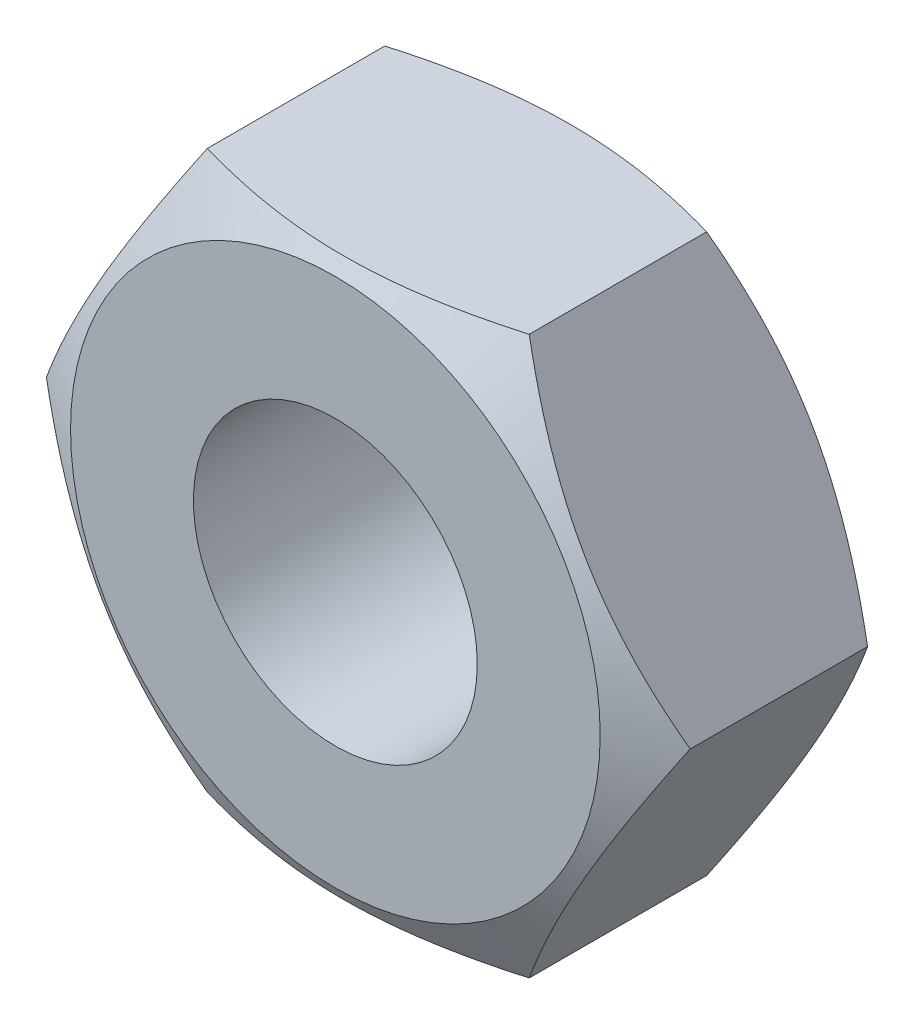
ISO-10303-21;
HEADER;
FILE_DESCRIPTION(('STEP AP214'),'2;1');
FILE_NAME('part.step','',(''),(''),'','','');
FILE_SCHEMA(('AUTOMOTIVE_DESIGN { 1 0 10303 214 1 1 1 1 }'));
ENDSEC;
DATA;
#1=APPLICATION_CONTEXT('core data for automotive mechanical design processes');
#2=APPLICATION_PROTOCOL_DEFINITION('international standard','automotive_design',2000,#1);
#3=PRODUCT_CONTEXT('',#1,'mechanical');
#4=PRODUCT('Part','Part','',(#3));
#5=PRODUCT_RELATED_PRODUCT_CATEGORY('part','',(#4));
#6=PRODUCT_DEFINITION_FORMATION('','',#4);
#7=PRODUCT_DEFINITION_CONTEXT('part definition',#1,'design');
#8=PRODUCT_DEFINITION('design','',#6,#7);
#9=PRODUCT_DEFINITION_SHAPE('','',#8);
#10=(LENGTH_UNIT() NAMED_UNIT(*) SI_UNIT(.MILLI.,.METRE.));
#11=(NAMED_UNIT(*) PLANE_ANGLE_UNIT() SI_UNIT($,.RADIAN.));
#12=(NAMED_UNIT(*) SI_UNIT($,.STERADIAN.) SOLID_ANGLE_UNIT());
#13=UNCERTAINTY_MEASURE_WITH_UNIT(LENGTH_MEASURE(1.E-05),#10,'distance_accuracy_value','');
#14=(GEOMETRIC_REPRESENTATION_CONTEXT(3) GLOBAL_UNCERTAINTY_ASSIGNED_CONTEXT((#13)) GLOBAL_UNIT_ASSIGNED_CONTEXT((#10,
#11,#12)) REPRESENTATION_CONTEXT('',''));
#15=CARTESIAN_POINT('',(0.,0.,0.));
#16=DIRECTION('',(0.,0.,1.));
#17=DIRECTION('',(1.,0.,0.));
#18=AXIS2_PLACEMENT_3D('',#15,#16,#17);
#19=CARTESIAN_POINT('',(0.,0.,0.));
#20=DIRECTION('',(0.,0.,1.));
#21=DIRECTION('',(0.,-1.,0.));
#22=AXIS2_PLACEMENT_3D('',#19,#20,#21);
#23=CONICAL_SURFACE('',#22,2.6125,1.0471975511966);
#24=CARTESIAN_POINT('',(0.,0.,0.));
#25=DIRECTION('',(0.,0.,1.));
#26=DIRECTION('',(1.,0.,0.));
#27=AXIS2_PLACEMENT_3D('',#24,#25,#26);
#28=CIRCLE('',#27,2.6125);
#29=CARTESIAN_POINT('',(2.6125,0.,0.));
#30=VERTEX_POINT('',#29);
#31=EDGE_CURVE('E11',#30,#30,#28,.T.);
#32=ORIENTED_EDGE('',*,*,#31,.T.);
#33=EDGE_LOOP('',(#32));
#34=FACE_BOUND('',#33,.T.);
#35=CARTESIAN_POINT('',(1.58759777021763,2.7502,0.325072425378332));
#36=CARTESIAN_POINT('',(1.65737010029699,2.62935077934009,0.284773324262835));
#37=CARTESIAN_POINT('',(1.72774469983533,2.50745839737737,0.248122564611234));
#38=CARTESIAN_POINT('',(1.86971254687003,2.26156287327211,0.184147844983373));
#39=CARTESIAN_POINT('',(1.94130831721583,2.13755536142614,0.15684651768807));
#40=CARTESIAN_POINT('',(2.08361254889599,1.89107720202406,0.11434740730769));
#41=CARTESIAN_POINT('',(2.15429911309864,1.76864448141258,0.0988667806360306));
#42=CARTESIAN_POINT('',(2.29600490065923,1.52320285763108,0.0803850593835131));
#43=CARTESIAN_POINT('',(2.36702360884404,1.40019484676709,0.0773686614761723));
#44=CARTESIAN_POINT('',(2.49972966594897,1.17034121338921,0.0836388074421193));
#45=CARTESIAN_POINT('',(2.56143686540073,1.06346120874598,0.0913858162902751));
#46=CARTESIAN_POINT('',(2.68444923614047,0.85039753266525,0.115940843077927));
#47=CARTESIAN_POINT('',(2.74575398185008,0.744214598351111,0.132757251664143));
#48=CARTESIAN_POINT('',(2.86902004703206,0.530711510606816,0.174797584359529));
#49=CARTESIAN_POINT('',(2.93096576264318,0.423418383857145,0.200199742700803));
#50=CARTESIAN_POINT('',(3.05393320806134,0.210432520715949,0.257852887853554));
#51=CARTESIAN_POINT('',(3.11495651365995,0.104737054973347,0.290090325312554));
#52=CARTESIAN_POINT('',(3.17554195059678,-0.000199999999999999,0.325072425378332));
#53=B_SPLINE_CURVE_WITH_KNOTS('',3,(#35,#36,#37,#38,#39,#40,#41,#42,#43,#44,#45,#46,#47,#48,#49,
#50,#51,#52),.UNSPECIFIED.,.F.,.F.,(4,2,2,2,2,2,2,2,4),(0.,0.435912828725888,0.872873557116332,
1.29901931904672,1.72464171213574,2.09526089052938,2.46622354066374,2.84541551798557,
3.22386274754524),.UNSPECIFIED.);
#54=CARTESIAN_POINT('',(1.58771324027147,2.75,0.325005755075434));
#55=VERTEX_POINT('',#54);
#56=CARTESIAN_POINT('',(3.17542648054294,0.,0.325005755075434));
#57=VERTEX_POINT('',#56);
#58=EDGE_CURVE('E170',#55,#57,#53,.T.);
#59=ORIENTED_EDGE('',*,*,#58,.T.);
#60=CARTESIAN_POINT('',(3.17554195059678,0.000199999999999895,0.325072425378332));
#61=CARTESIAN_POINT('',(3.10576962051743,-0.120649220659906,0.284773324262835));
#62=CARTESIAN_POINT('',(3.03539502097908,-0.242541602622634,0.248122564611234));
#63=CARTESIAN_POINT('',(2.89342717394439,-0.488437126727893,0.184147844983373));
#64=CARTESIAN_POINT('',(2.82183140359858,-0.612444638573856,0.15684651768807));
#65=CARTESIAN_POINT('',(2.67952717191842,-0.858922797975944,0.114347407307689));
#66=CARTESIAN_POINT('',(2.60884060771577,-0.981355518587418,0.0988667806360305));
#67=CARTESIAN_POINT('',(2.46713482015518,-1.22679714236892,0.0803850593835132));
#68=CARTESIAN_POINT('',(2.39611611197038,-1.34980515323291,0.0773686614761724));
#69=CARTESIAN_POINT('',(2.26341005486544,-1.57965878661079,0.0836388074421194));
#70=CARTESIAN_POINT('',(2.20170285541369,-1.68653879125402,0.0913858162902751));
#71=CARTESIAN_POINT('',(2.07869048467395,-1.89960246733475,0.115940843077928));
#72=CARTESIAN_POINT('',(2.01738573896433,-2.00578540164889,0.132757251664143));
#73=CARTESIAN_POINT('',(1.89411967378235,-2.21928848939318,0.174797584359529));
#74=CARTESIAN_POINT('',(1.83217395817123,-2.32658161614285,0.200199742700803));
#75=CARTESIAN_POINT('',(1.70920651275307,-2.53956747928405,0.257852887853554));
#76=CARTESIAN_POINT('',(1.64818320715446,-2.64526294502665,0.290090325312555));
#77=CARTESIAN_POINT('',(1.58759777021763,-2.7502,0.325072425378332));
#78=B_SPLINE_CURVE_WITH_KNOTS('',3,(#60,#61,#62,#63,#64,#65,#66,#67,#68,#69,#70,#71,#72,#73,#74,
#75,#76,#77),.UNSPECIFIED.,.F.,.F.,(4,2,2,2,2,2,2,2,4),(0.,0.435912828725888,0.872873557116332,
1.29901931904672,1.72464171213574,2.09526089052938,2.46622354066374,2.84541551798557,
3.22386274754524),.UNSPECIFIED.);
#79=CARTESIAN_POINT('',(1.58771324027147,-2.75,0.325005755075434));
#80=VERTEX_POINT('',#79);
#81=EDGE_CURVE('E60',#57,#80,#78,.T.);
#82=ORIENTED_EDGE('',*,*,#81,.T.);
#83=CARTESIAN_POINT('',(4.82209591409801,-2.75,1.69662218758663));
#84=CARTESIAN_POINT('',(4.70698459391359,-2.75,1.63889978333482));
#85=CARTESIAN_POINT('',(4.59167523097896,-2.75,1.58156823824504));
#86=CARTESIAN_POINT('',(4.36057376347925,-2.75,1.46787810056609));
#87=CARTESIAN_POINT('',(4.24478164413152,-2.75,1.4115195380467));
#88=CARTESIAN_POINT('',(4.01240519378639,-2.75,1.29985971222662));
#89=CARTESIAN_POINT('',(3.89581974792902,-2.75,1.24456076421826));
#90=CARTESIAN_POINT('',(3.66197617100479,-2.75,1.13539657081718));
#91=CARTESIAN_POINT('',(3.54471802983216,-2.75,1.08153134703193));
#92=CARTESIAN_POINT('',(3.30402977097251,-2.75,0.973149111400131));
#93=CARTESIAN_POINT('',(3.18056234581917,-2.75,0.918714677644329));
#94=CARTESIAN_POINT('',(2.93258356998985,-2.75,0.8122805667528));
#95=CARTESIAN_POINT('',(2.80807225529914,-2.75,0.760280806091854));
#96=CARTESIAN_POINT('',(2.55789086770319,-2.75,0.659412394645465));
#97=CARTESIAN_POINT('',(2.43222175656898,-2.75,0.61054137344382));
#98=CARTESIAN_POINT('',(2.17937205899324,-2.75,0.516746741866131));
#99=CARTESIAN_POINT('',(2.05219106628962,-2.75,0.471824221027262));
#100=CARTESIAN_POINT('',(1.76687012212302,-2.75,0.377381666854392));
#101=CARTESIAN_POINT('',(1.60829414480963,-2.75,0.329155252936632));
#102=CARTESIAN_POINT('',(1.28838166324069,-2.75,0.243095212306075));
#103=CARTESIAN_POINT('',(1.12704682552895,-2.75,0.205255531555934));
#104=CARTESIAN_POINT('',(0.804469695356104,-2.75,0.143637655205873));
#105=CARTESIAN_POINT('',(0.643272285950553,-2.75,0.119631751830708));
#106=CARTESIAN_POINT('',(0.319316042844211,-2.75,0.0874053958225154));
#107=CARTESIAN_POINT('',(0.15655793416937,-2.75,0.07917793940605));
#108=CARTESIAN_POINT('',(-0.170007651387069,-2.75,0.0796028206733506));
#109=CARTESIAN_POINT('',(-0.333814985979488,-2.75,0.0883665881586939));
#110=CARTESIAN_POINT('',(-0.659806452614739,-2.75,0.121807632000603));
#111=CARTESIAN_POINT('',(-0.821989792484144,-2.75,0.14649232384456));
#112=CARTESIAN_POINT('',(-1.14650984692983,-2.75,0.20953600114308));
#113=CARTESIAN_POINT('',(-1.30880056937426,-2.75,0.248124412024963));
#114=CARTESIAN_POINT('',(-1.63059177563563,-2.75,0.335684628702224));
#115=CARTESIAN_POINT('',(-1.79009058143429,-2.75,0.384662461535136));
#116=CARTESIAN_POINT('',(-2.07517756341798,-2.75,0.479817698571969));
#117=CARTESIAN_POINT('',(-2.20122944462247,-2.75,0.524630817745626));
#118=CARTESIAN_POINT('',(-2.45185743761155,-2.75,0.618089681394542));
#119=CARTESIAN_POINT('',(-2.57643394999465,-2.75,0.666734356726972));
#120=CARTESIAN_POINT('',(-2.82445462314632,-2.75,0.767063549197108));
#121=CARTESIAN_POINT('',(-2.94789789477543,-2.75,0.818750250764965));
#122=CARTESIAN_POINT('',(-3.19376461702501,-2.75,0.924497197071317));
#123=CARTESIAN_POINT('',(-3.31618803411527,-2.75,0.978557519484863));
#124=CARTESIAN_POINT('',(-3.55488294596269,-2.75,1.08617837731915));
#125=CARTESIAN_POINT('',(-3.67119073372333,-2.75,1.13965867593344));
#126=CARTESIAN_POINT('',(-3.90314682486718,-2.75,1.24802360616247));
#127=CARTESIAN_POINT('',(-4.01879513854485,-2.75,1.30290821578193));
#128=CARTESIAN_POINT('',(-4.2493210301962,-2.75,1.41372378832858));
#129=CARTESIAN_POINT('',(-4.36419964743295,-2.75,1.46965259375076));
#130=CARTESIAN_POINT('',(-4.59348248513188,-2.75,1.58246667802544));
#131=CARTESIAN_POINT('',(-4.70788671915892,-2.75,1.63935192929018));
#132=CARTESIAN_POINT('',(-4.82209591409802,-2.75,1.69662218758663));
#133=B_SPLINE_CURVE_WITH_KNOTS('',3,(#83,#84,#85,#86,#87,#88,#89,#90,#91,#92,#93,#94,#95,#96,
#97,#98,#99,#100,#101,#102,#103,#104,#105,#106,#107,#108,#109,#110,#111,#112,#113,#114,#115,
#116,#117,#118,#119,#120,#121,#122,#123,#124,#125,#126,#127,#128,#129,#130,#131,#132),
.UNSPECIFIED.,.F.,.F.,(4,2,2,2,2,2,2,2,2,2,2,2,2,2,2,2,2,2,2,2,2,2,2,2,4),(0.,0.38632105694132,
0.772654031738451,1.15975221487635,1.5468562286242,1.95163891266918,2.35640769982902,
2.7608661028432,3.16543576278735,3.66241517708883,4.15910430264312,4.64736533375746,
5.13540958392009,5.62666529559508,6.11814998479502,6.61814686810423,7.11843460318229,
7.51970628823735,7.92086639795479,8.32231817475426,8.72378309858282,9.10781470943075,
9.49184030899168,9.87514505132588,10.2584387565117),.UNSPECIFIED.);
#134=CARTESIAN_POINT('',(-1.58771324027179,-2.75,0.32500575507525));
#135=VERTEX_POINT('',#134);
#136=EDGE_CURVE('E103',#80,#135,#133,.T.);
#137=ORIENTED_EDGE('',*,*,#136,.T.);
#138=CARTESIAN_POINT('',(-1.58759777021763,-2.7502,0.325072425378333));
#139=CARTESIAN_POINT('',(-1.65737010029699,-2.62935077934009,0.284773324262836));
#140=CARTESIAN_POINT('',(-1.72774469983533,-2.50745839737736,0.248122564611235));
#141=CARTESIAN_POINT('',(-1.86971254687003,-2.26156287327211,0.184147844983374));
#142=CARTESIAN_POINT('',(-1.94130831721583,-2.13755536142614,0.15684651768807));
#143=CARTESIAN_POINT('',(-2.08361254889599,-1.89107720202405,0.11434740730769));
#144=CARTESIAN_POINT('',(-2.15429911309864,-1.76864448141258,0.0988667806360312));
#145=CARTESIAN_POINT('',(-2.29600490065923,-1.52320285763108,0.0803850593835139));
#146=CARTESIAN_POINT('',(-2.36702360884404,-1.40019484676709,0.0773686614761732));
#147=CARTESIAN_POINT('',(-2.49972966594897,-1.17034121338921,0.0836388074421203));
#148=CARTESIAN_POINT('',(-2.56143686540073,-1.06346120874598,0.091385816290276));
#149=CARTESIAN_POINT('',(-2.68444923614047,-0.850397532665249,0.115940843077928));
#150=CARTESIAN_POINT('',(-2.74575398185008,-0.744214598351109,0.132757251664144));
#151=CARTESIAN_POINT('',(-2.86902004703207,-0.530711510606815,0.17479758435953));
#152=CARTESIAN_POINT('',(-2.93096576264318,-0.423418383857143,0.200199742700804));
#153=CARTESIAN_POINT('',(-3.05393320806134,-0.210432520715948,0.257852887853555));
#154=CARTESIAN_POINT('',(-3.11495651365995,-0.104737054973347,0.290090325312556));
#155=CARTESIAN_POINT('',(-3.17554195059678,0.000200000000000823,0.325072425378333));
#156=B_SPLINE_CURVE_WITH_KNOTS('',3,(#138,#139,#140,#141,#142,#143,#144,#145,#146,#147,#148,
#149,#150,#151,#152,#153,#154,#155),.UNSPECIFIED.,.F.,.F.,(4,2,2,2,2,2,2,2,4),(0.,
0.435912828725889,0.872873557116332,1.29901931904672,1.72464171213574,2.09526089052938,
2.46622354066374,2.84541551798557,3.22386274754524),.UNSPECIFIED.);
#157=CARTESIAN_POINT('',(-3.17542648054294,0.,0.325005755075435));
#158=VERTEX_POINT('',#157);
#159=EDGE_CURVE('E113',#135,#158,#156,.T.);
#160=ORIENTED_EDGE('',*,*,#159,.T.);
#161=CARTESIAN_POINT('',(-3.17554195059678,-0.000199999999999133,0.325072425378333));
#162=CARTESIAN_POINT('',(-3.10576962051743,0.120649220659907,0.284773324262836));
#163=CARTESIAN_POINT('',(-3.03539502097908,0.242541602622635,0.248122564611235));
#164=CARTESIAN_POINT('',(-2.89342717394439,0.488437126727894,0.184147844983374));
#165=CARTESIAN_POINT('',(-2.82183140359858,0.612444638573856,0.156846517688071));
#166=CARTESIAN_POINT('',(-2.67952717191843,0.858922797975945,0.11434740730769));
#167=CARTESIAN_POINT('',(-2.60884060771577,0.981355518587418,0.0988667806360311));
#168=CARTESIAN_POINT('',(-2.46713482015519,1.22679714236892,0.0803850593835137));
#169=CARTESIAN_POINT('',(-2.39611611197038,1.34980515323291,0.077368661476173));
#170=CARTESIAN_POINT('',(-2.26341005486544,1.57965878661079,0.0836388074421199));
#171=CARTESIAN_POINT('',(-2.20170285541369,1.68653879125402,0.0913858162902755));
#172=CARTESIAN_POINT('',(-2.07869048467395,1.89960246733475,0.115940843077928));
#173=CARTESIAN_POINT('',(-2.01738573896433,2.00578540164889,0.132757251664143));
#174=CARTESIAN_POINT('',(-1.89411967378235,2.21928848939319,0.174797584359529));
#175=CARTESIAN_POINT('',(-1.83217395817123,2.32658161614286,0.200199742700803));
#176=CARTESIAN_POINT('',(-1.70920651275307,2.53956747928405,0.257852887853555));
#177=CARTESIAN_POINT('',(-1.64818320715446,2.64526294502665,0.290090325312555));
#178=CARTESIAN_POINT('',(-1.58759777021763,2.7502,0.325072425378333));
#179=B_SPLINE_CURVE_WITH_KNOTS('',3,(#161,#162,#163,#164,#165,#166,#167,#168,#169,#170,#171,
#172,#173,#174,#175,#176,#177,#178),.UNSPECIFIED.,.F.,.F.,(4,2,2,2,2,2,2,2,4),(0.,
0.435912828725889,0.872873557116333,1.29901931904672,1.72464171213574,2.09526089052938,
2.46622354066374,2.84541551798557,3.22386274754524),.UNSPECIFIED.);
#180=CARTESIAN_POINT('',(-1.58771324027147,2.75,0.325005755075434));
#181=VERTEX_POINT('',#180);
#182=EDGE_CURVE('E118',#158,#181,#179,.T.);
#183=ORIENTED_EDGE('',*,*,#182,.T.);
#184=CARTESIAN_POINT('',(-4.82209591409801,2.75,1.69662218758662));
#185=CARTESIAN_POINT('',(-4.70698459391359,2.75,1.63889978333482));
#186=CARTESIAN_POINT('',(-4.59167523097896,2.75,1.58156823824504));
#187=CARTESIAN_POINT('',(-4.36057376347925,2.75,1.46787810056609));
#188=CARTESIAN_POINT('',(-4.24478164413152,2.75,1.4115195380467));
#189=CARTESIAN_POINT('',(-4.01240519378638,2.75,1.29985971222661));
#190=CARTESIAN_POINT('',(-3.89581974792902,2.75,1.24456076421826));
#191=CARTESIAN_POINT('',(-3.66197617100479,2.75,1.13539657081718));
#192=CARTESIAN_POINT('',(-3.54471802983216,2.75,1.08153134703193));
#193=CARTESIAN_POINT('',(-3.30402977097251,2.75,0.973149111400131));
#194=CARTESIAN_POINT('',(-3.18056234581917,2.75,0.918714677644328));
#195=CARTESIAN_POINT('',(-2.93258356998985,2.75,0.812280566752799));
#196=CARTESIAN_POINT('',(-2.80807225529914,2.75,0.760280806091854));
#197=CARTESIAN_POINT('',(-2.55789086770319,2.75,0.659412394645465));
#198=CARTESIAN_POINT('',(-2.43222175656898,2.75,0.61054137344382));
#199=CARTESIAN_POINT('',(-2.17937205899324,2.75,0.516746741866131));
#200=CARTESIAN_POINT('',(-2.05219106628962,2.75,0.471824221027262));
#201=CARTESIAN_POINT('',(-1.76687012212302,2.75,0.377381666854392));
#202=CARTESIAN_POINT('',(-1.60829414480963,2.75,0.329155252936632));
#203=CARTESIAN_POINT('',(-1.28838166324069,2.75,0.243095212306075));
#204=CARTESIAN_POINT('',(-1.12704682552895,2.75,0.205255531555934));
#205=CARTESIAN_POINT('',(-0.804469695356103,2.75,0.143637655205873));
#206=CARTESIAN_POINT('',(-0.643272285950553,2.75,0.119631751830708));
#207=CARTESIAN_POINT('',(-0.319316042844211,2.75,0.0874053958225156));
#208=CARTESIAN_POINT('',(-0.156557934169369,2.75,0.0791779394060501));
#209=CARTESIAN_POINT('',(0.17000765138707,2.75,0.0796028206733509));
#210=CARTESIAN_POINT('',(0.333814985979488,2.75,0.0883665881586945));
#211=CARTESIAN_POINT('',(0.659806452614739,2.75,0.121807632000603));
#212=CARTESIAN_POINT('',(0.821989792484144,2.75,0.14649232384456));
#213=CARTESIAN_POINT('',(1.14650984692983,2.75,0.20953600114308));
#214=CARTESIAN_POINT('',(1.30880056937426,2.75,0.248124412024964));
#215=CARTESIAN_POINT('',(1.63059177563563,2.75,0.335684628702225));
#216=CARTESIAN_POINT('',(1.79009058143429,2.75,0.384662461535136));
#217=CARTESIAN_POINT('',(2.07517756341798,2.75,0.479817698571969));
#218=CARTESIAN_POINT('',(2.20122944462247,2.75,0.524630817745627));
#219=CARTESIAN_POINT('',(2.45185743761155,2.75,0.618089681394543));
#220=CARTESIAN_POINT('',(2.57643394999465,2.75,0.666734356726972));
#221=CARTESIAN_POINT('',(2.82445462314632,2.75,0.767063549197108));
#222=CARTESIAN_POINT('',(2.94789789477543,2.75,0.818750250764965));
#223=CARTESIAN_POINT('',(3.19376461702501,2.75,0.924497197071317));
#224=CARTESIAN_POINT('',(3.31618803411527,2.75,0.978557519484863));
#225=CARTESIAN_POINT('',(3.55488294596268,2.75,1.08617837731914));
#226=CARTESIAN_POINT('',(3.67119073372333,2.75,1.13965867593344));
#227=CARTESIAN_POINT('',(3.90314682486717,2.75,1.24802360616247));
#228=CARTESIAN_POINT('',(4.01879513854485,2.75,1.30290821578193));
#229=CARTESIAN_POINT('',(4.2493210301962,2.75,1.41372378832857));
#230=CARTESIAN_POINT('',(4.36419964743295,2.75,1.46965259375076));
#231=CARTESIAN_POINT('',(4.59348248513188,2.75,1.58246667802544));
#232=CARTESIAN_POINT('',(4.70788671915892,2.75,1.63935192929018));
#233=CARTESIAN_POINT('',(4.82209591409801,2.75,1.69662218758662));
#234=B_SPLINE_CURVE_WITH_KNOTS('',3,(#184,#185,#186,#187,#188,#189,#190,#191,#192,#193,#194,
#195,#196,#197,#198,#199,#200,#201,#202,#203,#204,#205,#206,#207,#208,#209,#210,#211,#212,#213,
#214,#215,#216,#217,#218,#219,#220,#221,#222,#223,#224,#225,#226,#227,#228,#229,#230,#231,#232,
#233),.UNSPECIFIED.,.F.,.F.,(4,2,2,2,2,2,2,2,2,2,2,2,2,2,2,2,2,2,2,2,2,2,2,2,4),(0.,
0.386321056941319,0.772654031738451,1.15975221487635,1.5468562286242,1.95163891266918,
2.35640769982902,2.7608661028432,3.16543576278735,3.66241517708883,4.15910430264312,
4.64736533375746,5.13540958392009,5.62666529559507,6.11814998479502,6.61814686810422,
7.11843460318228,7.51970628823735,7.92086639795479,8.32231817475425,8.72378309858282,
9.10781470943075,9.49184030899168,9.87514505132588,10.2584387565117),.UNSPECIFIED.);
#235=EDGE_CURVE('E163',#181,#55,#234,.T.);
#236=ORIENTED_EDGE('',*,*,#235,.T.);
#237=EDGE_LOOP('',(#59,#82,#137,#160,#183,#236));
#238=FACE_BOUND('',#237,.T.);
#239=ADVANCED_FACE('F43',(#34,#238),#23,.T.);
#240=CARTESIAN_POINT('',(3.17542648054294,0.,0.));
#241=DIRECTION('',(0.,0.,1.));
#242=DIRECTION('',(-0.5,0.866025403784439,0.));
#243=AXIS2_PLACEMENT_3D('',#240,#241,#242);
#244=PLANE('',#243);
#245=CARTESIAN_POINT('',(0.,0.,0.));
#246=DIRECTION('',(0.,0.,1.));
#247=DIRECTION('',(1.,0.,0.));
#248=AXIS2_PLACEMENT_3D('',#245,#246,#247);
#249=CIRCLE('',#248,1.4);
#250=CARTESIAN_POINT('',(1.4,0.,0.));
#251=VERTEX_POINT('',#250);
#252=EDGE_CURVE('E124',#251,#251,#249,.F.);
#253=ORIENTED_EDGE('',*,*,#252,.F.);
#254=EDGE_LOOP('',(#253));
#255=FACE_BOUND('',#254,.T.);
#256=ORIENTED_EDGE('',*,*,#31,.F.);
#257=EDGE_LOOP('',(#256));
#258=FACE_BOUND('',#257,.T.);
#259=ADVANCED_FACE('F145',(#255,#258),#244,.F.);
#260=CARTESIAN_POINT('',(1.58771324027147,-2.75,2.4));
#261=DIRECTION('',(-0.866025403784439,0.5,0.));
#262=DIRECTION('',(-0.5,-0.866025403784439,0.));
#263=AXIS2_PLACEMENT_3D('',#260,#261,#262);
#264=PLANE('',#263);
#265=ORIENTED_EDGE('',*,*,#81,.F.);
#266=DIRECTION('',(0.,0.,-1.));
#267=VECTOR('',#266,1.);
#268=CARTESIAN_POINT('',(3.17542648054294,0.,2.4));
#269=LINE('',#268,#267);
#270=CARTESIAN_POINT('',(3.17542648054294,0.,2.07499424492457));
#271=VERTEX_POINT('',#270);
#272=EDGE_CURVE('E53',#271,#57,#269,.T.);
#273=ORIENTED_EDGE('',*,*,#272,.F.);
#274=CARTESIAN_POINT('',(1.58759777021763,-2.7502,2.07492757462167));
#275=CARTESIAN_POINT('',(1.65737010029699,-2.62935077934009,2.11522667573716));
#276=CARTESIAN_POINT('',(1.72774469983533,-2.50745839737737,2.15187743538876));
#277=CARTESIAN_POINT('',(1.86971254687003,-2.26156287327211,2.21585215501663));
#278=CARTESIAN_POINT('',(1.94130831721583,-2.13755536142614,2.24315348231193));
#279=CARTESIAN_POINT('',(2.08361254889599,-1.89107720202406,2.28565259269231));
#280=CARTESIAN_POINT('',(2.15429911309864,-1.76864448141258,2.30113321936397));
#281=CARTESIAN_POINT('',(2.29600490065923,-1.52320285763109,2.31961494061649));
#282=CARTESIAN_POINT('',(2.36702360884404,-1.40019484676709,2.32263133852383));
#283=CARTESIAN_POINT('',(2.49972966594897,-1.17034121338921,2.31636119255788));
#284=CARTESIAN_POINT('',(2.56143686540073,-1.06346120874598,2.30861418370972));
#285=CARTESIAN_POINT('',(2.68444923614046,-0.850397532665251,2.28405915692207));
#286=CARTESIAN_POINT('',(2.74575398185008,-0.744214598351112,2.26724274833586));
#287=CARTESIAN_POINT('',(2.86902004703206,-0.530711510606817,2.22520241564047));
#288=CARTESIAN_POINT('',(2.93096576264318,-0.423418383857146,2.1998002572992));
#289=CARTESIAN_POINT('',(3.05393320806134,-0.210432520715949,2.14214711214645));
#290=CARTESIAN_POINT('',(3.11495651365995,-0.104737054973348,2.10990967468745));
#291=CARTESIAN_POINT('',(3.17554195059678,0.00019999999999995,2.07492757462167));
#292=B_SPLINE_CURVE_WITH_KNOTS('',3,(#274,#275,#276,#277,#278,#279,#280,#281,#282,#283,#284,
#285,#286,#287,#288,#289,#290,#291),.UNSPECIFIED.,.F.,.F.,(4,2,2,2,2,2,2,2,4),(0.,
0.435912828725888,0.872873557116332,1.29901931904671,1.72464171213574,2.09526089052937,
2.46622354066374,2.84541551798557,3.22386274754524),.UNSPECIFIED.);
#293=CARTESIAN_POINT('',(1.58771324027179,-2.75,2.07499424492475));
#294=VERTEX_POINT('',#293);
#295=EDGE_CURVE('E193',#294,#271,#292,.T.);
#296=ORIENTED_EDGE('',*,*,#295,.F.);
#297=DIRECTION('',(0.,0.,-1.));
#298=VECTOR('',#297,1.);
#299=CARTESIAN_POINT('',(1.58771324027147,-2.75,2.4));
#300=LINE('',#299,#298);
#301=EDGE_CURVE('E109',#294,#80,#300,.T.);
#302=ORIENTED_EDGE('',*,*,#301,.T.);
#303=EDGE_LOOP('',(#265,#273,#296,#302));
#304=FACE_BOUND('',#303,.T.);
#305=ADVANCED_FACE('F45',(#304),#264,.F.);
#306=CARTESIAN_POINT('',(3.17542648054294,0.,2.4));
#307=DIRECTION('',(-0.866025403784439,-0.5,0.));
#308=DIRECTION('',(0.,0.,1.));
#309=AXIS2_PLACEMENT_3D('',#306,#307,#308);
#310=PLANE('',#309);
#311=ORIENTED_EDGE('',*,*,#58,.F.);
#312=DIRECTION('',(0.,0.,-1.));
#313=VECTOR('',#312,1.);
#314=CARTESIAN_POINT('',(1.58771324027147,2.75,2.4));
#315=LINE('',#314,#313);
#316=CARTESIAN_POINT('',(1.58771324027147,2.75,2.07499424492456));
#317=VERTEX_POINT('',#316);
#318=EDGE_CURVE('E211',#317,#55,#315,.T.);
#319=ORIENTED_EDGE('',*,*,#318,.F.);
#320=CARTESIAN_POINT('',(3.17554195059678,-0.00020000000000001,2.07492757462167));
#321=CARTESIAN_POINT('',(3.10576962051743,0.120649220659906,2.11522667573716));
#322=CARTESIAN_POINT('',(3.03539502097908,0.242541602622634,2.15187743538876));
#323=CARTESIAN_POINT('',(2.89342717394439,0.488437126727892,2.21585215501663));
#324=CARTESIAN_POINT('',(2.82183140359858,0.612444638573855,2.24315348231193));
#325=CARTESIAN_POINT('',(2.67952717191842,0.858922797975944,2.28565259269231));
#326=CARTESIAN_POINT('',(2.60884060771577,0.981355518587417,2.30113321936397));
#327=CARTESIAN_POINT('',(2.46713482015518,1.22679714236892,2.31961494061649));
#328=CARTESIAN_POINT('',(2.39611611197038,1.34980515323291,2.32263133852383));
#329=CARTESIAN_POINT('',(2.26341005486544,1.57965878661079,2.31636119255788));
#330=CARTESIAN_POINT('',(2.20170285541369,1.68653879125402,2.30861418370972));
#331=CARTESIAN_POINT('',(2.07869048467395,1.89960246733475,2.28405915692207));
#332=CARTESIAN_POINT('',(2.01738573896433,2.00578540164889,2.26724274833586));
#333=CARTESIAN_POINT('',(1.89411967378235,2.21928848939318,2.22520241564047));
#334=CARTESIAN_POINT('',(1.83217395817123,2.32658161614285,2.1998002572992));
#335=CARTESIAN_POINT('',(1.70920651275308,2.53956747928405,2.14214711214644));
#336=CARTESIAN_POINT('',(1.64818320715446,2.64526294502665,2.10990967468744));
#337=CARTESIAN_POINT('',(1.58759777021763,2.7502,2.07492757462167));
#338=B_SPLINE_CURVE_WITH_KNOTS('',3,(#320,#321,#322,#323,#324,#325,#326,#327,#328,#329,#330,
#331,#332,#333,#334,#335,#336,#337),.UNSPECIFIED.,.F.,.F.,(4,2,2,2,2,2,2,2,4),(0.,
0.435912828725888,0.872873557116332,1.29901931904671,1.72464171213573,2.09526089052937,
2.46622354066374,2.84541551798557,3.22386274754524),.UNSPECIFIED.);
#339=EDGE_CURVE('E67',#271,#317,#338,.T.);
#340=ORIENTED_EDGE('',*,*,#339,.F.);
#341=ORIENTED_EDGE('',*,*,#272,.T.);
#342=EDGE_LOOP('',(#311,#319,#340,#341));
#343=FACE_BOUND('',#342,.T.);
#344=ADVANCED_FACE('F180',(#343),#310,.F.);
#345=CARTESIAN_POINT('',(1.58771324027147,2.75,2.4));
#346=DIRECTION('',(0.,-1.,0.));
#347=DIRECTION('',(1.,0.,0.));
#348=AXIS2_PLACEMENT_3D('',#345,#346,#347);
#349=PLANE('',#348);
#350=ORIENTED_EDGE('',*,*,#235,.F.);
#351=DIRECTION('',(0.,0.,-1.));
#352=VECTOR('',#351,1.);
#353=CARTESIAN_POINT('',(-1.58771324027147,2.75,2.4));
#354=LINE('',#353,#352);
#355=CARTESIAN_POINT('',(-1.58771324027147,2.75,2.07499424492456));
#356=VERTEX_POINT('',#355);
#357=EDGE_CURVE('E208',#356,#181,#354,.T.);
#358=ORIENTED_EDGE('',*,*,#357,.F.);
#359=CARTESIAN_POINT('',(4.82209591409801,2.75,0.703377812413375));
#360=CARTESIAN_POINT('',(4.70698459391359,2.75,0.761100216665176));
#361=CARTESIAN_POINT('',(4.59167523097896,2.75,0.818431761754962));
#362=CARTESIAN_POINT('',(4.36057376347925,2.75,0.932121899433909));
#363=CARTESIAN_POINT('',(4.24478164413152,2.75,0.988480461953298));
#364=CARTESIAN_POINT('',(4.01240519378638,2.75,1.10014028777339));
#365=CARTESIAN_POINT('',(3.89581974792902,2.75,1.15543923578174));
#366=CARTESIAN_POINT('',(3.66197617100479,2.75,1.26460342918282));
#367=CARTESIAN_POINT('',(3.54471802983216,2.75,1.31846865296806));
#368=CARTESIAN_POINT('',(3.30402977097251,2.75,1.42685088859987));
#369=CARTESIAN_POINT('',(3.18056234581917,2.75,1.48128532235567));
#370=CARTESIAN_POINT('',(2.93258356998985,2.75,1.5877194332472));
#371=CARTESIAN_POINT('',(2.80807225529914,2.75,1.63971919390815));
#372=CARTESIAN_POINT('',(2.55789086770319,2.75,1.74058760535453));
#373=CARTESIAN_POINT('',(2.43222175656898,2.75,1.78945862655618));
#374=CARTESIAN_POINT('',(2.17937205899324,2.75,1.88325325813387));
#375=CARTESIAN_POINT('',(2.05219106628962,2.75,1.92817577897274));
#376=CARTESIAN_POINT('',(1.76687012212301,2.75,2.02261833314561));
#377=CARTESIAN_POINT('',(1.60829414480963,2.75,2.07084474706337));
#378=CARTESIAN_POINT('',(1.28838166324069,2.75,2.15690478769392));
#379=CARTESIAN_POINT('',(1.12704682552895,2.75,2.19474446844406));
#380=CARTESIAN_POINT('',(0.804469695356103,2.75,2.25636234479413));
#381=CARTESIAN_POINT('',(0.643272285950553,2.75,2.28036824816929));
#382=CARTESIAN_POINT('',(0.319316042844211,2.75,2.31259460417748));
#383=CARTESIAN_POINT('',(0.156557934169369,2.75,2.32082206059395));
#384=CARTESIAN_POINT('',(-0.17000765138707,2.75,2.32039717932665));
#385=CARTESIAN_POINT('',(-0.333814985979488,2.75,2.3116334118413));
#386=CARTESIAN_POINT('',(-0.659806452614739,2.75,2.2781923679994));
#387=CARTESIAN_POINT('',(-0.821989792484145,2.75,2.25350767615544));
#388=CARTESIAN_POINT('',(-1.14650984692983,2.75,2.19046399885692));
#389=CARTESIAN_POINT('',(-1.30880056937426,2.75,2.15187558797504));
#390=CARTESIAN_POINT('',(-1.63059177563563,2.75,2.06431537129777));
#391=CARTESIAN_POINT('',(-1.79009058143429,2.75,2.01533753846486));
#392=CARTESIAN_POINT('',(-2.07517756341798,2.75,1.92018230142803));
#393=CARTESIAN_POINT('',(-2.20122944462247,2.75,1.87536918225437));
#394=CARTESIAN_POINT('',(-2.45185743761155,2.75,1.78191031860546));
#395=CARTESIAN_POINT('',(-2.57643394999465,2.75,1.73326564327303));
#396=CARTESIAN_POINT('',(-2.82445462314632,2.75,1.63293645080289));
#397=CARTESIAN_POINT('',(-2.94789789477543,2.75,1.58124974923503));
#398=CARTESIAN_POINT('',(-3.19376461702501,2.75,1.47550280292868));
#399=CARTESIAN_POINT('',(-3.31618803411527,2.75,1.42144248051514));
#400=CARTESIAN_POINT('',(-3.55488294596268,2.75,1.31382162268085));
#401=CARTESIAN_POINT('',(-3.67119073372333,2.75,1.26034132406656));
#402=CARTESIAN_POINT('',(-3.90314682486717,2.75,1.15197639383753));
#403=CARTESIAN_POINT('',(-4.01879513854485,2.75,1.09709178421807));
#404=CARTESIAN_POINT('',(-4.2493210301962,2.75,0.986276211671425));
#405=CARTESIAN_POINT('',(-4.36419964743295,2.75,0.93034740624924));
#406=CARTESIAN_POINT('',(-4.59348248513187,2.75,0.817533321974564));
#407=CARTESIAN_POINT('',(-4.70788671915892,2.75,0.76064807070982));
#408=CARTESIAN_POINT('',(-4.82209591409801,2.75,0.703377812413375));
#409=B_SPLINE_CURVE_WITH_KNOTS('',3,(#359,#360,#361,#362,#363,#364,#365,#366,#367,#368,#369,
#370,#371,#372,#373,#374,#375,#376,#377,#378,#379,#380,#381,#382,#383,#384,#385,#386,#387,#388,
#389,#390,#391,#392,#393,#394,#395,#396,#397,#398,#399,#400,#401,#402,#403,#404,#405,#406,#407,
#408),.UNSPECIFIED.,.F.,.F.,(4,2,2,2,2,2,2,2,2,2,2,2,2,2,2,2,2,2,2,2,2,2,2,2,4),(0.,
0.38632105694132,0.772654031738452,1.15975221487635,1.5468562286242,1.95163891266918,
2.35640769982902,2.7608661028432,3.16543576278735,3.66241517708883,4.15910430264312,
4.64736533375746,5.13540958392009,5.62666529559507,6.11814998479502,6.61814686810422,
7.11843460318229,7.51970628823735,7.92086639795479,8.32231817475425,8.72378309858282,
9.10781470943075,9.49184030899167,9.87514505132587,10.2584387565117),.UNSPECIFIED.);
#410=EDGE_CURVE('E194',#317,#356,#409,.T.);
#411=ORIENTED_EDGE('',*,*,#410,.F.);
#412=ORIENTED_EDGE('',*,*,#318,.T.);
#413=EDGE_LOOP('',(#350,#358,#411,#412));
#414=FACE_BOUND('',#413,.T.);
#415=ADVANCED_FACE('F183',(#414),#349,.F.);
#416=CARTESIAN_POINT('',(-1.58771324027147,2.75,2.4));
#417=DIRECTION('',(0.866025403784438,-0.500000000000001,0.));
#418=DIRECTION('',(0.500000000000001,0.866025403784438,0.));
#419=AXIS2_PLACEMENT_3D('',#416,#417,#418);
#420=PLANE('',#419);
#421=ORIENTED_EDGE('',*,*,#182,.F.);
#422=DIRECTION('',(0.,0.,-1.));
#423=VECTOR('',#422,1.);
#424=CARTESIAN_POINT('',(-3.17542648054294,0.,2.4));
#425=LINE('',#424,#423);
#426=CARTESIAN_POINT('',(-3.17542648054294,0.,2.07499424492456));
#427=VERTEX_POINT('',#426);
#428=EDGE_CURVE('E108',#427,#158,#425,.T.);
#429=ORIENTED_EDGE('',*,*,#428,.F.);
#430=CARTESIAN_POINT('',(-1.58759777021763,2.7502,2.07492757462167));
#431=CARTESIAN_POINT('',(-1.65737010029699,2.62935077934009,2.11522667573716));
#432=CARTESIAN_POINT('',(-1.72774469983533,2.50745839737737,2.15187743538876));
#433=CARTESIAN_POINT('',(-1.86971254687003,2.26156287327211,2.21585215501663));
#434=CARTESIAN_POINT('',(-1.94130831721583,2.13755536142615,2.24315348231193));
#435=CARTESIAN_POINT('',(-2.08361254889599,1.89107720202406,2.28565259269231));
#436=CARTESIAN_POINT('',(-2.15429911309864,1.76864448141258,2.30113321936397));
#437=CARTESIAN_POINT('',(-2.29600490065923,1.52320285763109,2.31961494061649));
#438=CARTESIAN_POINT('',(-2.36702360884404,1.40019484676709,2.32263133852383));
#439=CARTESIAN_POINT('',(-2.49972966594897,1.17034121338921,2.31636119255788));
#440=CARTESIAN_POINT('',(-2.56143686540073,1.06346120874598,2.30861418370972));
#441=CARTESIAN_POINT('',(-2.68444923614047,0.850397532665251,2.28405915692207));
#442=CARTESIAN_POINT('',(-2.74575398185008,0.744214598351112,2.26724274833586));
#443=CARTESIAN_POINT('',(-2.86902004703206,0.530711510606817,2.22520241564047));
#444=CARTESIAN_POINT('',(-2.93096576264318,0.423418383857146,2.1998002572992));
#445=CARTESIAN_POINT('',(-3.05393320806134,0.21043252071595,2.14214711214644));
#446=CARTESIAN_POINT('',(-3.11495651365995,0.104737054973348,2.10990967468744));
#447=CARTESIAN_POINT('',(-3.17554195059678,-0.000199999999999142,2.07492757462167));
#448=B_SPLINE_CURVE_WITH_KNOTS('',3,(#430,#431,#432,#433,#434,#435,#436,#437,#438,#439,#440,
#441,#442,#443,#444,#445,#446,#447),.UNSPECIFIED.,.F.,.F.,(4,2,2,2,2,2,2,2,4),(0.,
0.435912828725888,0.872873557116332,1.29901931904671,1.72464171213574,2.09526089052938,
2.46622354066374,2.84541551798557,3.22386274754524),.UNSPECIFIED.);
#449=EDGE_CURVE('E222',#356,#427,#448,.T.);
#450=ORIENTED_EDGE('',*,*,#449,.F.);
#451=ORIENTED_EDGE('',*,*,#357,.T.);
#452=EDGE_LOOP('',(#421,#429,#450,#451));
#453=FACE_BOUND('',#452,.T.);
#454=ADVANCED_FACE('F220',(#453),#420,.F.);
#455=CARTESIAN_POINT('',(-3.17542648054294,0.,2.4));
#456=DIRECTION('',(0.866025403784439,0.5,0.));
#457=DIRECTION('',(0.,0.,-1.));
#458=AXIS2_PLACEMENT_3D('',#455,#456,#457);
#459=PLANE('',#458);
#460=ORIENTED_EDGE('',*,*,#159,.F.);
#461=DIRECTION('',(0.,0.,-1.));
#462=VECTOR('',#461,1.);
#463=CARTESIAN_POINT('',(-1.58771324027147,-2.75,2.4));
#464=LINE('',#463,#462);
#465=CARTESIAN_POINT('',(-1.58771324027147,-2.75,2.07499424492457));
#466=VERTEX_POINT('',#465);
#467=EDGE_CURVE('E99',#466,#135,#464,.T.);
#468=ORIENTED_EDGE('',*,*,#467,.F.);
#469=CARTESIAN_POINT('',(-3.17554195059678,0.000200000000000935,2.07492757462167));
#470=CARTESIAN_POINT('',(-3.10576962051743,-0.120649220659905,2.11522667573716));
#471=CARTESIAN_POINT('',(-3.03539502097908,-0.242541602622633,2.15187743538876));
#472=CARTESIAN_POINT('',(-2.89342717394439,-0.488437126727892,2.21585215501663));
#473=CARTESIAN_POINT('',(-2.82183140359858,-0.612444638573855,2.24315348231193));
#474=CARTESIAN_POINT('',(-2.67952717191843,-0.858922797975943,2.28565259269231));
#475=CARTESIAN_POINT('',(-2.60884060771577,-0.981355518587417,2.30113321936397));
#476=CARTESIAN_POINT('',(-2.46713482015519,-1.22679714236892,2.31961494061649));
#477=CARTESIAN_POINT('',(-2.39611611197038,-1.34980515323291,2.32263133852383));
#478=CARTESIAN_POINT('',(-2.26341005486544,-1.57965878661079,2.31636119255788));
#479=CARTESIAN_POINT('',(-2.20170285541369,-1.68653879125402,2.30861418370972));
#480=CARTESIAN_POINT('',(-2.07869048467395,-1.89960246733475,2.28405915692207));
#481=CARTESIAN_POINT('',(-2.01738573896434,-2.00578540164889,2.26724274833586));
#482=CARTESIAN_POINT('',(-1.89411967378235,-2.21928848939318,2.22520241564047));
#483=CARTESIAN_POINT('',(-1.83217395817123,-2.32658161614285,2.1998002572992));
#484=CARTESIAN_POINT('',(-1.70920651275308,-2.53956747928405,2.14214711214644));
#485=CARTESIAN_POINT('',(-1.64818320715446,-2.64526294502665,2.10990967468744));
#486=CARTESIAN_POINT('',(-1.58759777021763,-2.7502,2.07492757462167));
#487=B_SPLINE_CURVE_WITH_KNOTS('',3,(#469,#470,#471,#472,#473,#474,#475,#476,#477,#478,#479,
#480,#481,#482,#483,#484,#485,#486),.UNSPECIFIED.,.F.,.F.,(4,2,2,2,2,2,2,2,4),(0.,
0.435912828725888,0.872873557116332,1.29901931904672,1.72464171213574,2.09526089052938,
2.46622354066374,2.84541551798557,3.22386274754524),.UNSPECIFIED.);
#488=EDGE_CURVE('E224',#427,#466,#487,.T.);
#489=ORIENTED_EDGE('',*,*,#488,.F.);
#490=ORIENTED_EDGE('',*,*,#428,.T.);
#491=EDGE_LOOP('',(#460,#468,#489,#490));
#492=FACE_BOUND('',#491,.T.);
#493=ADVANCED_FACE('F114',(#492),#459,.F.);
#494=CARTESIAN_POINT('',(-1.58771324027147,-2.75,2.4));
#495=DIRECTION('',(0.,1.,0.));
#496=DIRECTION('',(-1.,0.,0.));
#497=AXIS2_PLACEMENT_3D('',#494,#495,#496);
#498=PLANE('',#497);
#499=ORIENTED_EDGE('',*,*,#136,.F.);
#500=ORIENTED_EDGE('',*,*,#301,.F.);
#501=CARTESIAN_POINT('',(-4.82209591409802,-2.75,0.703377812413374));
#502=CARTESIAN_POINT('',(-4.7069845939136,-2.75,0.761100216665175));
#503=CARTESIAN_POINT('',(-4.59167523097897,-2.75,0.818431761754961));
#504=CARTESIAN_POINT('',(-4.36057376347925,-2.75,0.932121899433908));
#505=CARTESIAN_POINT('',(-4.24478164413152,-2.75,0.988480461953297));
#506=CARTESIAN_POINT('',(-4.01240519378639,-2.75,1.10014028777338));
#507=CARTESIAN_POINT('',(-3.89581974792902,-2.75,1.15543923578174));
#508=CARTESIAN_POINT('',(-3.6619761710048,-2.75,1.26460342918282));
#509=CARTESIAN_POINT('',(-3.54471802983216,-2.75,1.31846865296806));
#510=CARTESIAN_POINT('',(-3.30402977097251,-2.75,1.42685088859987));
#511=CARTESIAN_POINT('',(-3.18056234581917,-2.75,1.48128532235567));
#512=CARTESIAN_POINT('',(-2.93258356998985,-2.75,1.5877194332472));
#513=CARTESIAN_POINT('',(-2.80807225529915,-2.75,1.63971919390814));
#514=CARTESIAN_POINT('',(-2.55789086770319,-2.75,1.74058760535453));
#515=CARTESIAN_POINT('',(-2.43222175656899,-2.75,1.78945862655618));
#516=CARTESIAN_POINT('',(-2.17937205899324,-2.75,1.88325325813387));
#517=CARTESIAN_POINT('',(-2.05219106628963,-2.75,1.92817577897274));
#518=CARTESIAN_POINT('',(-1.76687012212302,-2.75,2.02261833314561));
#519=CARTESIAN_POINT('',(-1.60829414480963,-2.75,2.07084474706337));
#520=CARTESIAN_POINT('',(-1.28838166324069,-2.75,2.15690478769392));
#521=CARTESIAN_POINT('',(-1.12704682552895,-2.75,2.19474446844407));
#522=CARTESIAN_POINT('',(-0.804469695356106,-2.75,2.25636234479413));
#523=CARTESIAN_POINT('',(-0.643272285950556,-2.75,2.28036824816929));
#524=CARTESIAN_POINT('',(-0.319316042844213,-2.75,2.31259460417748));
#525=CARTESIAN_POINT('',(-0.156557934169371,-2.75,2.32082206059395));
#526=CARTESIAN_POINT('',(0.170007651387068,-2.75,2.32039717932665));
#527=CARTESIAN_POINT('',(0.333814985979487,-2.75,2.31163341184131));
#528=CARTESIAN_POINT('',(0.659806452614738,-2.75,2.2781923679994));
#529=CARTESIAN_POINT('',(0.821989792484143,-2.75,2.25350767615544));
#530=CARTESIAN_POINT('',(1.14650984692982,-2.75,2.19046399885692));
#531=CARTESIAN_POINT('',(1.30880056937426,-2.75,2.15187558797504));
#532=CARTESIAN_POINT('',(1.63059177563562,-2.75,2.06431537129777));
#533=CARTESIAN_POINT('',(1.79009058143429,-2.75,2.01533753846486));
#534=CARTESIAN_POINT('',(2.07517756341797,-2.75,1.92018230142803));
#535=CARTESIAN_POINT('',(2.20122944462247,-2.75,1.87536918225437));
#536=CARTESIAN_POINT('',(2.45185743761155,-2.75,1.78191031860546));
#537=CARTESIAN_POINT('',(2.57643394999465,-2.75,1.73326564327303));
#538=CARTESIAN_POINT('',(2.82445462314632,-2.75,1.63293645080289));
#539=CARTESIAN_POINT('',(2.94789789477543,-2.75,1.58124974923503));
#540=CARTESIAN_POINT('',(3.19376461702501,-2.75,1.47550280292868));
#541=CARTESIAN_POINT('',(3.31618803411527,-2.75,1.42144248051514));
#542=CARTESIAN_POINT('',(3.55488294596268,-2.75,1.31382162268085));
#543=CARTESIAN_POINT('',(3.67119073372333,-2.75,1.26034132406656));
#544=CARTESIAN_POINT('',(3.90314682486718,-2.75,1.15197639383753));
#545=CARTESIAN_POINT('',(4.01879513854485,-2.75,1.09709178421807));
#546=CARTESIAN_POINT('',(4.2493210301962,-2.75,0.986276211671423));
#547=CARTESIAN_POINT('',(4.36419964743295,-2.75,0.930347406249238));
#548=CARTESIAN_POINT('',(4.59348248513188,-2.75,0.817533321974563));
#549=CARTESIAN_POINT('',(4.70788671915892,-2.75,0.760648070709819));
#550=CARTESIAN_POINT('',(4.82209591409801,-2.75,0.703377812413374));
#551=B_SPLINE_CURVE_WITH_KNOTS('',3,(#501,#502,#503,#504,#505,#506,#507,#508,#509,#510,#511,
#512,#513,#514,#515,#516,#517,#518,#519,#520,#521,#522,#523,#524,#525,#526,#527,#528,#529,#530,
#531,#532,#533,#534,#535,#536,#537,#538,#539,#540,#541,#542,#543,#544,#545,#546,#547,#548,#549,
#550),.UNSPECIFIED.,.F.,.F.,(4,2,2,2,2,2,2,2,2,2,2,2,2,2,2,2,2,2,2,2,2,2,2,2,4),(0.,
0.386321056941321,0.772654031738452,1.15975221487635,1.5468562286242,1.95163891266918,
2.35640769982902,2.7608661028432,3.16543576278735,3.66241517708883,4.15910430264312,
4.64736533375746,5.13540958392009,5.62666529559508,6.11814998479503,6.61814686810423,
7.11843460318229,7.51970628823735,7.92086639795479,8.32231817475426,8.72378309858282,
9.10781470943076,9.49184030899168,9.87514505132588,10.2584387565117),.UNSPECIFIED.);
#552=EDGE_CURVE('E105',#466,#294,#551,.T.);
#553=ORIENTED_EDGE('',*,*,#552,.F.);
#554=ORIENTED_EDGE('',*,*,#467,.T.);
#555=EDGE_LOOP('',(#499,#500,#553,#554));
#556=FACE_BOUND('',#555,.T.);
#557=ADVANCED_FACE('F101',(#556),#498,.F.);
#558=CARTESIAN_POINT('',(0.,0.,1.78631911032975));
#559=DIRECTION('',(0.,0.,-1.));
#560=DIRECTION('',(0.,1.,0.));
#561=AXIS2_PLACEMENT_3D('',#558,#559,#560);
#562=CONICAL_SURFACE('',#561,3.67542648054294,1.0471975511966);
#563=CARTESIAN_POINT('',(0.,0.,2.4));
#564=DIRECTION('',(0.,0.,-1.));
#565=DIRECTION('',(0.,1.,0.));
#566=AXIS2_PLACEMENT_3D('',#563,#564,#565);
#567=CIRCLE('',#566,2.6125);
#568=CARTESIAN_POINT('',(0.,2.6125,2.4));
#569=VERTEX_POINT('',#568);
#570=EDGE_CURVE('E121',#569,#569,#567,.T.);
#571=ORIENTED_EDGE('',*,*,#570,.T.);
#572=EDGE_LOOP('',(#571));
#573=FACE_BOUND('',#572,.T.);
#574=ORIENTED_EDGE('',*,*,#552,.T.);
#575=ORIENTED_EDGE('',*,*,#295,.T.);
#576=ORIENTED_EDGE('',*,*,#339,.T.);
#577=ORIENTED_EDGE('',*,*,#410,.T.);
#578=ORIENTED_EDGE('',*,*,#449,.T.);
#579=ORIENTED_EDGE('',*,*,#488,.T.);
#580=EDGE_LOOP('',(#574,#575,#576,#577,#578,#579));
#581=FACE_BOUND('',#580,.T.);
#582=ADVANCED_FACE('F147',(#573,#581),#562,.T.);
#583=CARTESIAN_POINT('',(3.17542648054294,0.,2.4));
#584=DIRECTION('',(0.,0.,1.));
#585=DIRECTION('',(-0.5,0.866025403784439,0.));
#586=AXIS2_PLACEMENT_3D('',#583,#584,#585);
#587=PLANE('',#586);
#588=CARTESIAN_POINT('',(0.,0.,2.4));
#589=DIRECTION('',(0.,0.,1.));
#590=DIRECTION('',(1.,0.,0.));
#591=AXIS2_PLACEMENT_3D('',#588,#589,#590);
#592=CIRCLE('',#591,1.4);
#593=CARTESIAN_POINT('',(1.4,0.,2.4));
#594=VERTEX_POINT('',#593);
#595=EDGE_CURVE('E48',#594,#594,#592,.F.);
#596=ORIENTED_EDGE('',*,*,#595,.T.);
#597=EDGE_LOOP('',(#596));
#598=FACE_BOUND('',#597,.T.);
#599=ORIENTED_EDGE('',*,*,#570,.F.);
#600=EDGE_LOOP('',(#599));
#601=FACE_BOUND('',#600,.T.);
#602=ADVANCED_FACE('F150',(#598,#601),#587,.T.);
#603=CARTESIAN_POINT('',(0.,0.,5.));
#604=DIRECTION('',(0.,0.,-1.));
#605=DIRECTION('',(-1.,0.,0.));
#606=AXIS2_PLACEMENT_3D('',#603,#604,#605);
#607=CYLINDRICAL_SURFACE('',#606,1.4);
#608=ORIENTED_EDGE('',*,*,#595,.F.);
#609=EDGE_LOOP('',(#608));
#610=FACE_BOUND('',#609,.T.);
#611=ORIENTED_EDGE('',*,*,#252,.T.);
#612=EDGE_LOOP('',(#611));
#613=FACE_BOUND('',#612,.T.);
#614=ADVANCED_FACE('F250',(#610,#613),#607,.F.);
#615=CLOSED_SHELL('',(#239,#259,#305,#344,#415,#454,#493,#557,#582,#602,#614));
#616=MANIFOLD_SOLID_BREP('B2',#615);
#617=ADVANCED_BREP_SHAPE_REPRESENTATION('',(#18,#616),#14);
#618=SHAPE_DEFINITION_REPRESENTATION(#9,#617);
ENDSEC;
END-ISO-10303-21;
